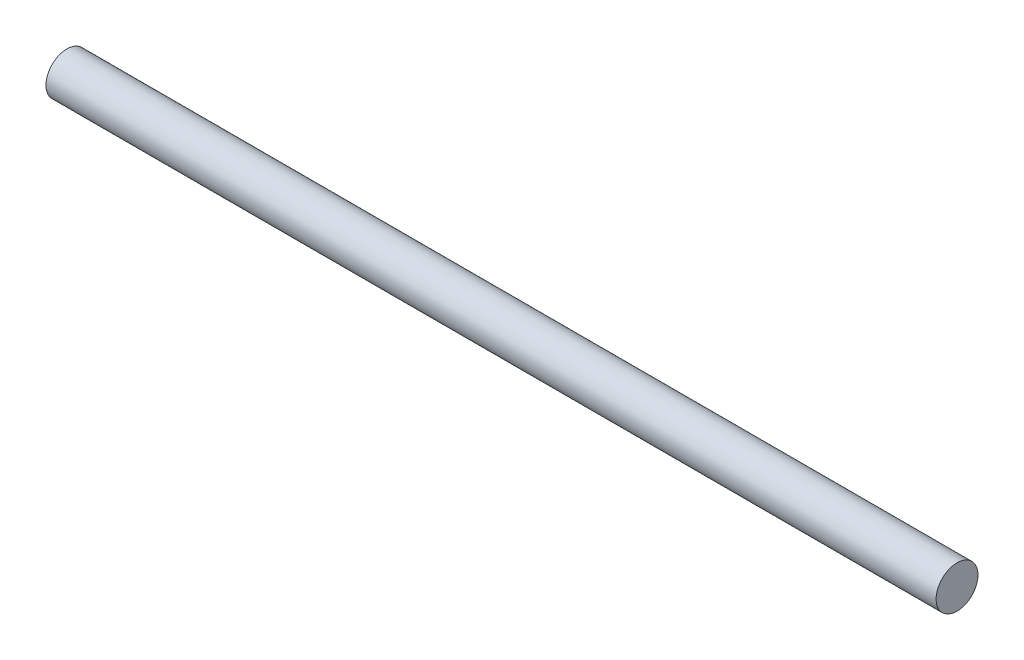
ISO-10303-21;
HEADER;
FILE_DESCRIPTION(('STEP AP214'),'2;1');
FILE_NAME('part.step','',(''),(''),'','','');
FILE_SCHEMA(('AUTOMOTIVE_DESIGN { 1 0 10303 214 1 1 1 1 }'));
ENDSEC;
DATA;
#1=APPLICATION_CONTEXT('core data for automotive mechanical design processes');
#2=APPLICATION_PROTOCOL_DEFINITION('international standard','automotive_design',2000,#1);
#3=PRODUCT_CONTEXT('',#1,'mechanical');
#4=PRODUCT('Part','Part','',(#3));
#5=PRODUCT_RELATED_PRODUCT_CATEGORY('part','',(#4));
#6=PRODUCT_DEFINITION_FORMATION('','',#4);
#7=PRODUCT_DEFINITION_CONTEXT('part definition',#1,'design');
#8=PRODUCT_DEFINITION('design','',#6,#7);
#9=PRODUCT_DEFINITION_SHAPE('','',#8);
#10=(LENGTH_UNIT() NAMED_UNIT(*) SI_UNIT(.MILLI.,.METRE.));
#11=(NAMED_UNIT(*) PLANE_ANGLE_UNIT() SI_UNIT($,.RADIAN.));
#12=(NAMED_UNIT(*) SI_UNIT($,.STERADIAN.) SOLID_ANGLE_UNIT());
#13=UNCERTAINTY_MEASURE_WITH_UNIT(LENGTH_MEASURE(1.E-05),#10,'distance_accuracy_value','');
#14=(GEOMETRIC_REPRESENTATION_CONTEXT(3) GLOBAL_UNCERTAINTY_ASSIGNED_CONTEXT((#13)) GLOBAL_UNIT_ASSIGNED_CONTEXT((#10,
#11,#12)) REPRESENTATION_CONTEXT('',''));
#15=CARTESIAN_POINT('',(0.,0.,0.));
#16=DIRECTION('',(0.,0.,1.));
#17=DIRECTION('',(1.,0.,0.));
#18=AXIS2_PLACEMENT_3D('',#15,#16,#17);
#19=CARTESIAN_POINT('',(430.,0.,0.));
#20=DIRECTION('',(-1.,0.,0.));
#21=DIRECTION('',(0.,0.,1.));
#22=AXIS2_PLACEMENT_3D('',#19,#20,#21);
#23=CYLINDRICAL_SURFACE('',#22,10.125);
#24=CARTESIAN_POINT('',(430.,0.,0.));
#25=DIRECTION('',(1.,0.,0.));
#26=DIRECTION('',(0.,0.,-1.));
#27=AXIS2_PLACEMENT_3D('',#24,#25,#26);
#28=CIRCLE('',#27,10.125);
#29=CARTESIAN_POINT('',(430.,0.,-10.125));
#30=VERTEX_POINT('',#29);
#31=EDGE_CURVE('E10',#30,#30,#28,.T.);
#32=ORIENTED_EDGE('',*,*,#31,.F.);
#33=EDGE_LOOP('',(#32));
#34=FACE_BOUND('',#33,.T.);
#35=CARTESIAN_POINT('',(0.,0.,0.));
#36=DIRECTION('',(1.,0.,0.));
#37=DIRECTION('',(0.,0.,-1.));
#38=AXIS2_PLACEMENT_3D('',#35,#36,#37);
#39=CIRCLE('',#38,10.125);
#40=CARTESIAN_POINT('',(0.,0.,-10.125));
#41=VERTEX_POINT('',#40);
#42=EDGE_CURVE('E34',#41,#41,#39,.T.);
#43=ORIENTED_EDGE('',*,*,#42,.T.);
#44=EDGE_LOOP('',(#43));
#45=FACE_BOUND('',#44,.T.);
#46=ADVANCED_FACE('F31',(#34,#45),#23,.T.);
#47=CARTESIAN_POINT('',(430.,0.,0.));
#48=DIRECTION('',(1.,0.,0.));
#49=DIRECTION('',(0.,0.,-1.));
#50=AXIS2_PLACEMENT_3D('',#47,#48,#49);
#51=PLANE('',#50);
#52=ORIENTED_EDGE('',*,*,#31,.T.);
#53=EDGE_LOOP('',(#52));
#54=FACE_BOUND('',#53,.T.);
#55=ADVANCED_FACE('F46',(#54),#51,.T.);
#56=CARTESIAN_POINT('',(0.,0.,0.));
#57=DIRECTION('',(1.,0.,0.));
#58=DIRECTION('',(0.,0.,-1.));
#59=AXIS2_PLACEMENT_3D('',#56,#57,#58);
#60=PLANE('',#59);
#61=ORIENTED_EDGE('',*,*,#42,.F.);
#62=EDGE_LOOP('',(#61));
#63=FACE_BOUND('',#62,.T.);
#64=ADVANCED_FACE('F44',(#63),#60,.F.);
#65=CLOSED_SHELL('',(#46,#55,#64));
#66=MANIFOLD_SOLID_BREP('B2',#65);
#67=ADVANCED_BREP_SHAPE_REPRESENTATION('',(#18,#66),#14);
#68=SHAPE_DEFINITION_REPRESENTATION(#9,#67);
ENDSEC;
END-ISO-10303-21;
